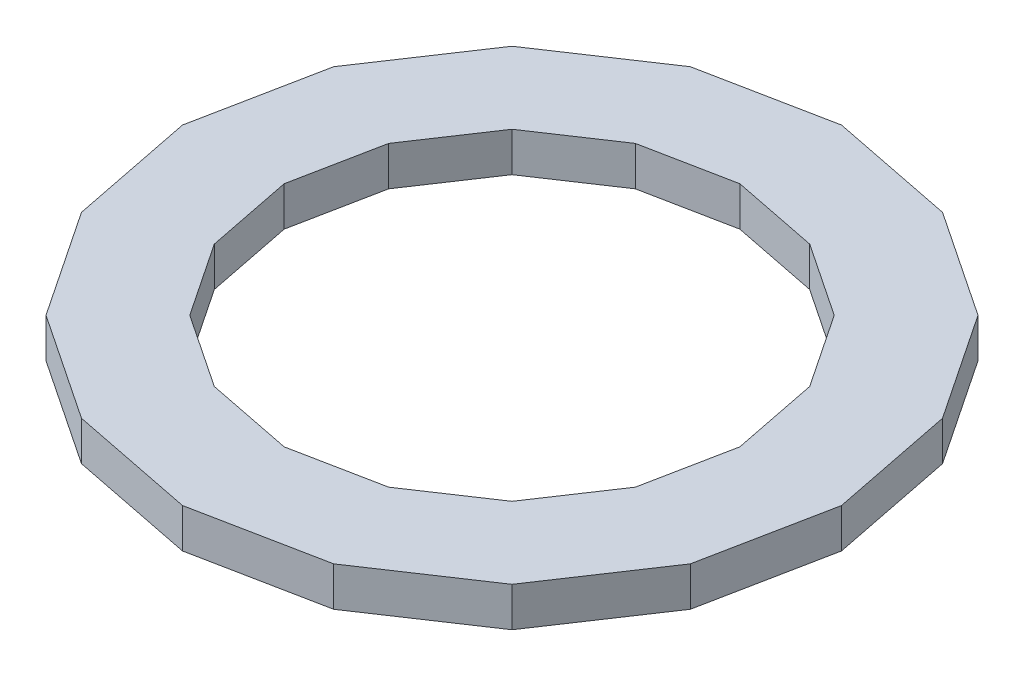
ISO-10303-21;
HEADER;
FILE_DESCRIPTION(('STEP AP214'),'2;1');
FILE_NAME('part.step','',(''),(''),'','','');
FILE_SCHEMA(('AUTOMOTIVE_DESIGN { 1 0 10303 214 1 1 1 1 }'));
ENDSEC;
DATA;
#1=APPLICATION_CONTEXT('core data for automotive mechanical design processes');
#2=APPLICATION_PROTOCOL_DEFINITION('international standard','automotive_design',2000,#1);
#3=PRODUCT_CONTEXT('',#1,'mechanical');
#4=PRODUCT('Part','Part','',(#3));
#5=PRODUCT_RELATED_PRODUCT_CATEGORY('part','',(#4));
#6=PRODUCT_DEFINITION_FORMATION('','',#4);
#7=PRODUCT_DEFINITION_CONTEXT('part definition',#1,'design');
#8=PRODUCT_DEFINITION('design','',#6,#7);
#9=PRODUCT_DEFINITION_SHAPE('','',#8);
#10=(LENGTH_UNIT() NAMED_UNIT(*) SI_UNIT(.MILLI.,.METRE.));
#11=(NAMED_UNIT(*) PLANE_ANGLE_UNIT() SI_UNIT($,.RADIAN.));
#12=(NAMED_UNIT(*) SI_UNIT($,.STERADIAN.) SOLID_ANGLE_UNIT());
#13=UNCERTAINTY_MEASURE_WITH_UNIT(LENGTH_MEASURE(1.E-05),#10,'distance_accuracy_value','');
#14=(GEOMETRIC_REPRESENTATION_CONTEXT(3) GLOBAL_UNCERTAINTY_ASSIGNED_CONTEXT((#13)) GLOBAL_UNIT_ASSIGNED_CONTEXT((#10,
#11,#12)) REPRESENTATION_CONTEXT('',''));
#15=CARTESIAN_POINT('',(0.,0.,0.));
#16=DIRECTION('',(0.,0.,1.));
#17=DIRECTION('',(1.,0.,0.));
#18=AXIS2_PLACEMENT_3D('',#15,#16,#17);
#19=CARTESIAN_POINT('',(0.,19.05,0.));
#20=DIRECTION('',(0.,1.,0.));
#21=DIRECTION('',(0.,0.,1.));
#22=AXIS2_PLACEMENT_3D('',#19,#20,#21);
#23=PLANE('',#22);
#24=DIRECTION('',(0.195090322016117,0.,-0.980785280403233));
#25=VECTOR('',#24,1.);
#26=CARTESIAN_POINT('',(147.349757573891,19.05,61.0342679994914));
#27=LINE('',#26,#25);
#28=CARTESIAN_POINT('',(147.349757573891,19.05,61.0342679994914));
#29=VERTEX_POINT('',#28);
#30=CARTESIAN_POINT('',(159.490228312954,19.05,-1.72778951291163E-12));
#31=VERTEX_POINT('',#30);
#32=EDGE_CURVE('E377',#29,#31,#27,.T.);
#33=ORIENTED_EDGE('',*,*,#32,.T.);
#34=DIRECTION('',(-0.195090322016139,0.,-0.980785280403228));
#35=VECTOR('',#34,1.);
#36=CARTESIAN_POINT('',(159.490228312954,19.05,-1.72778951291163E-12));
#37=LINE('',#36,#35);
#38=CARTESIAN_POINT('',(147.34975757389,19.05,-61.0342679994946));
#39=VERTEX_POINT('',#38);
#40=EDGE_CURVE('E381',#31,#39,#37,.T.);
#41=ORIENTED_EDGE('',*,*,#40,.T.);
#42=DIRECTION('',(-0.555570233019612,0.,-0.831469612302539));
#43=VECTOR('',#42,1.);
#44=CARTESIAN_POINT('',(147.34975757389,19.05,-61.0342679994946));
#45=LINE('',#44,#43);
#46=CARTESIAN_POINT('',(112.776621973079,19.05,-112.776621973082));
#47=VERTEX_POINT('',#46);
#48=EDGE_CURVE('E385',#39,#47,#45,.T.);
#49=ORIENTED_EDGE('',*,*,#48,.T.);
#50=DIRECTION('',(-0.831469612302551,0.,-0.555570233019593));
#51=VECTOR('',#50,1.);
#52=CARTESIAN_POINT('',(112.776621973079,19.05,-112.776621973082));
#53=LINE('',#52,#51);
#54=CARTESIAN_POINT('',(61.0342679994913,19.05,-147.349757573891));
#55=VERTEX_POINT('',#54);
#56=EDGE_CURVE('E388',#47,#55,#53,.T.);
#57=ORIENTED_EDGE('',*,*,#56,.T.);
#58=DIRECTION('',(-0.980785280403233,0.,-0.195090322016117));
#59=VECTOR('',#58,1.);
#60=CARTESIAN_POINT('',(61.0342679994913,19.05,-147.349757573891));
#61=LINE('',#60,#59);
#62=CARTESIAN_POINT('',(-1.75551672665465E-12,19.05,-159.490228312954));
#63=VERTEX_POINT('',#62);
#64=EDGE_CURVE('E390',#55,#63,#61,.T.);
#65=ORIENTED_EDGE('',*,*,#64,.T.);
#66=DIRECTION('',(-0.980785280403228,0.,0.195090322016139));
#67=VECTOR('',#66,1.);
#68=CARTESIAN_POINT('',(-1.75551672665465E-12,19.05,-159.490228312954));
#69=LINE('',#68,#67);
#70=CARTESIAN_POINT('',(-61.0342679994947,19.05,-147.34975757389));
#71=VERTEX_POINT('',#70);
#72=EDGE_CURVE('E392',#63,#71,#69,.T.);
#73=ORIENTED_EDGE('',*,*,#72,.T.);
#74=DIRECTION('',(-0.831469612302539,0.,0.555570233019612));
#75=VECTOR('',#74,1.);
#76=CARTESIAN_POINT('',(-61.0342679994947,19.05,-147.34975757389));
#77=LINE('',#76,#75);
#78=CARTESIAN_POINT('',(-112.776621973082,19.05,-112.776621973079));
#79=VERTEX_POINT('',#78);
#80=EDGE_CURVE('E394',#71,#79,#77,.T.);
#81=ORIENTED_EDGE('',*,*,#80,.T.);
#82=DIRECTION('',(-0.555570233019593,0.,0.831469612302551));
#83=VECTOR('',#82,1.);
#84=CARTESIAN_POINT('',(-112.776621973082,19.05,-112.776621973079));
#85=LINE('',#84,#83);
#86=CARTESIAN_POINT('',(-147.349757573891,19.05,-61.0342679994913));
#87=VERTEX_POINT('',#86);
#88=EDGE_CURVE('E396',#79,#87,#85,.T.);
#89=ORIENTED_EDGE('',*,*,#88,.T.);
#90=DIRECTION('',(-0.195090322016117,0.,0.980785280403233));
#91=VECTOR('',#90,1.);
#92=CARTESIAN_POINT('',(-147.349757573891,19.05,-61.0342679994913));
#93=LINE('',#92,#91);
#94=CARTESIAN_POINT('',(-159.490228312954,19.05,1.80363225978175E-12));
#95=VERTEX_POINT('',#94);
#96=EDGE_CURVE('E398',#87,#95,#93,.T.);
#97=ORIENTED_EDGE('',*,*,#96,.T.);
#98=DIRECTION('',(0.195090322016139,0.,0.980785280403228));
#99=VECTOR('',#98,1.);
#100=CARTESIAN_POINT('',(-159.490228312954,19.05,1.80363225978175E-12));
#101=LINE('',#100,#99);
#102=CARTESIAN_POINT('',(-147.34975757389,19.05,61.0342679994947));
#103=VERTEX_POINT('',#102);
#104=EDGE_CURVE('E400',#95,#103,#101,.T.);
#105=ORIENTED_EDGE('',*,*,#104,.T.);
#106=DIRECTION('',(0.555570233019611,0.,0.831469612302539));
#107=VECTOR('',#106,1.);
#108=CARTESIAN_POINT('',(-147.34975757389,19.05,61.0342679994947));
#109=LINE('',#108,#107);
#110=CARTESIAN_POINT('',(-112.776621973079,19.05,112.776621973082));
#111=VERTEX_POINT('',#110);
#112=EDGE_CURVE('E402',#103,#111,#109,.T.);
#113=ORIENTED_EDGE('',*,*,#112,.T.);
#114=DIRECTION('',(0.831469612302551,0.,0.555570233019593));
#115=VECTOR('',#114,1.);
#116=CARTESIAN_POINT('',(-112.776621973079,19.05,112.776621973082));
#117=LINE('',#116,#115);
#118=CARTESIAN_POINT('',(-61.0342679994914,19.05,147.349757573891));
#119=VERTEX_POINT('',#118);
#120=EDGE_CURVE('E404',#111,#119,#117,.T.);
#121=ORIENTED_EDGE('',*,*,#120,.T.);
#122=DIRECTION('',(0.980785280403233,0.,0.195090322016117));
#123=VECTOR('',#122,1.);
#124=CARTESIAN_POINT('',(-61.0342679994914,19.05,147.349757573891));
#125=LINE('',#124,#123);
#126=CARTESIAN_POINT('',(1.70609786640707E-12,19.05,159.490228312954));
#127=VERTEX_POINT('',#126);
#128=EDGE_CURVE('E406',#119,#127,#125,.T.);
#129=ORIENTED_EDGE('',*,*,#128,.T.);
#130=DIRECTION('',(0.980785280403228,0.,-0.195090322016139));
#131=VECTOR('',#130,1.);
#132=CARTESIAN_POINT('',(1.70609786640707E-12,19.05,159.490228312954));
#133=LINE('',#132,#131);
#134=CARTESIAN_POINT('',(61.0342679994947,19.05,147.34975757389));
#135=VERTEX_POINT('',#134);
#136=EDGE_CURVE('E408',#127,#135,#133,.T.);
#137=ORIENTED_EDGE('',*,*,#136,.T.);
#138=DIRECTION('',(0.831469612302539,0.,-0.555570233019611));
#139=VECTOR('',#138,1.);
#140=CARTESIAN_POINT('',(61.0342679994947,19.05,147.34975757389));
#141=LINE('',#140,#139);
#142=CARTESIAN_POINT('',(112.776621973082,19.05,112.776621973079));
#143=VERTEX_POINT('',#142);
#144=EDGE_CURVE('E410',#135,#143,#141,.T.);
#145=ORIENTED_EDGE('',*,*,#144,.T.);
#146=DIRECTION('',(0.555570233019593,0.,-0.831469612302551));
#147=VECTOR('',#146,1.);
#148=CARTESIAN_POINT('',(112.776621973082,19.05,112.776621973079));
#149=LINE('',#148,#147);
#150=EDGE_CURVE('E412',#143,#29,#149,.T.);
#151=ORIENTED_EDGE('',*,*,#150,.T.);
#152=EDGE_LOOP('',(#33,#41,#49,#57,#65,#73,#81,#89,#97,#105,#113,#121,#129,#137,#145,#151));
#153=FACE_BOUND('',#152,.T.);
#154=DIRECTION('',(-0.19509032201614,0.,-0.980785280403228));
#155=VECTOR('',#154,1.);
#156=CARTESIAN_POINT('',(110.28475901782,19.05,-1.28436945901502E-12));
#157=LINE('',#156,#155);
#158=CARTESIAN_POINT('',(110.28475901782,19.05,-1.28436945901502E-12));
#159=VERTEX_POINT('',#158);
#160=CARTESIAN_POINT('',(101.889831604503,19.05,-42.2041501184974));
#161=VERTEX_POINT('',#160);
#162=EDGE_CURVE('E252',#159,#161,#157,.T.);
#163=ORIENTED_EDGE('',*,*,#162,.F.);
#164=DIRECTION('',(0.195090322016117,0.,-0.980785280403233));
#165=VECTOR('',#164,1.);
#166=CARTESIAN_POINT('',(101.889831604504,19.05,42.2041501184951));
#167=LINE('',#166,#165);
#168=CARTESIAN_POINT('',(101.889831604504,19.05,42.2041501184951));
#169=VERTEX_POINT('',#168);
#170=EDGE_CURVE('E243',#169,#159,#167,.T.);
#171=ORIENTED_EDGE('',*,*,#170,.F.);
#172=DIRECTION('',(0.555570233019593,0.,-0.831469612302552));
#173=VECTOR('',#172,1.);
#174=CARTESIAN_POINT('',(77.983100963026,19.05,77.9831009630241));
#175=LINE('',#174,#173);
#176=CARTESIAN_POINT('',(77.983100963026,19.05,77.9831009630241));
#177=VERTEX_POINT('',#176);
#178=EDGE_CURVE('E302',#177,#169,#175,.T.);
#179=ORIENTED_EDGE('',*,*,#178,.F.);
#180=DIRECTION('',(0.831469612302539,0.,-0.555570233019612));
#181=VECTOR('',#180,1.);
#182=CARTESIAN_POINT('',(42.2041501184975,19.05,101.889831604503));
#183=LINE('',#182,#181);
#184=CARTESIAN_POINT('',(42.2041501184975,19.05,101.889831604503));
#185=VERTEX_POINT('',#184);
#186=EDGE_CURVE('E300',#185,#177,#183,.T.);
#187=ORIENTED_EDGE('',*,*,#186,.F.);
#188=DIRECTION('',(0.980785280403228,0.,-0.19509032201614));
#189=VECTOR('',#188,1.);
#190=CARTESIAN_POINT('',(1.30543120234615E-12,19.05,110.28475901782));
#191=LINE('',#190,#189);
#192=CARTESIAN_POINT('',(1.30543120234615E-12,19.05,110.28475901782));
#193=VERTEX_POINT('',#192);
#194=EDGE_CURVE('E298',#193,#185,#191,.T.);
#195=ORIENTED_EDGE('',*,*,#194,.F.);
#196=DIRECTION('',(0.980785280403233,0.,0.195090322016117));
#197=VECTOR('',#196,1.);
#198=CARTESIAN_POINT('',(-42.204150118495,19.05,101.889831604504));
#199=LINE('',#198,#197);
#200=CARTESIAN_POINT('',(-42.204150118495,19.05,101.889831604504));
#201=VERTEX_POINT('',#200);
#202=EDGE_CURVE('E296',#201,#193,#199,.T.);
#203=ORIENTED_EDGE('',*,*,#202,.F.);
#204=DIRECTION('',(0.831469612302552,0.,0.555570233019592));
#205=VECTOR('',#204,1.);
#206=CARTESIAN_POINT('',(-77.983100963024,19.05,77.983100963026));
#207=LINE('',#206,#205);
#208=CARTESIAN_POINT('',(-77.983100963024,19.05,77.983100963026));
#209=VERTEX_POINT('',#208);
#210=EDGE_CURVE('E294',#209,#201,#207,.T.);
#211=ORIENTED_EDGE('',*,*,#210,.F.);
#212=DIRECTION('',(0.555570233019612,0.,0.831469612302539));
#213=VECTOR('',#212,1.);
#214=CARTESIAN_POINT('',(-101.889831604503,19.05,42.2041501184975));
#215=LINE('',#214,#213);
#216=CARTESIAN_POINT('',(-101.889831604503,19.05,42.2041501184975));
#217=VERTEX_POINT('',#216);
#218=EDGE_CURVE('E291',#217,#209,#215,.T.);
#219=ORIENTED_EDGE('',*,*,#218,.F.);
#220=DIRECTION('',(0.19509032201614,0.,0.980785280403228));
#221=VECTOR('',#220,1.);
#222=CARTESIAN_POINT('',(-110.28475901782,19.05,1.31795296718562E-12));
#223=LINE('',#222,#221);
#224=CARTESIAN_POINT('',(-110.28475901782,19.05,1.31795296718562E-12));
#225=VERTEX_POINT('',#224);
#226=EDGE_CURVE('E289',#225,#217,#223,.T.);
#227=ORIENTED_EDGE('',*,*,#226,.F.);
#228=DIRECTION('',(-0.195090322016117,0.,0.980785280403233));
#229=VECTOR('',#228,1.);
#230=CARTESIAN_POINT('',(-101.889831604504,19.05,-42.204150118495));
#231=LINE('',#230,#229);
#232=CARTESIAN_POINT('',(-101.889831604504,19.05,-42.204150118495));
#233=VERTEX_POINT('',#232);
#234=EDGE_CURVE('E286',#233,#225,#231,.T.);
#235=ORIENTED_EDGE('',*,*,#234,.F.);
#236=DIRECTION('',(-0.555570233019592,0.,0.831469612302552));
#237=VECTOR('',#236,1.);
#238=CARTESIAN_POINT('',(-77.9831009630259,19.05,-77.983100963024));
#239=LINE('',#238,#237);
#240=CARTESIAN_POINT('',(-77.9831009630259,19.05,-77.983100963024));
#241=VERTEX_POINT('',#240);
#242=EDGE_CURVE('E284',#241,#233,#239,.T.);
#243=ORIENTED_EDGE('',*,*,#242,.F.);
#244=DIRECTION('',(-0.831469612302538,0.,0.555570233019613));
#245=VECTOR('',#244,1.);
#246=CARTESIAN_POINT('',(-42.2041501184975,19.05,-101.889831604503));
#247=LINE('',#246,#245);
#248=CARTESIAN_POINT('',(-42.2041501184975,19.05,-101.889831604503));
#249=VERTEX_POINT('',#248);
#250=EDGE_CURVE('E281',#249,#241,#247,.T.);
#251=ORIENTED_EDGE('',*,*,#250,.F.);
#252=DIRECTION('',(-0.980785280403228,0.,0.19509032201614));
#253=VECTOR('',#252,1.);
#254=CARTESIAN_POINT('',(-1.29763754362119E-12,19.05,-110.28475901782));
#255=LINE('',#254,#253);
#256=CARTESIAN_POINT('',(-1.29763754362119E-12,19.05,-110.28475901782));
#257=VERTEX_POINT('',#256);
#258=EDGE_CURVE('E279',#257,#249,#255,.T.);
#259=ORIENTED_EDGE('',*,*,#258,.F.);
#260=DIRECTION('',(-0.980785280403233,0.,-0.195090322016116));
#261=VECTOR('',#260,1.);
#262=CARTESIAN_POINT('',(42.2041501184951,19.05,-101.889831604504));
#263=LINE('',#262,#261);
#264=CARTESIAN_POINT('',(42.2041501184951,19.05,-101.889831604504));
#265=VERTEX_POINT('',#264);
#266=EDGE_CURVE('E277',#265,#257,#263,.T.);
#267=ORIENTED_EDGE('',*,*,#266,.F.);
#268=DIRECTION('',(-0.831469612302552,0.,-0.555570233019592));
#269=VECTOR('',#268,1.);
#270=CARTESIAN_POINT('',(77.9831009630241,19.05,-77.9831009630259));
#271=LINE('',#270,#269);
#272=CARTESIAN_POINT('',(77.9831009630241,19.05,-77.9831009630259));
#273=VERTEX_POINT('',#272);
#274=EDGE_CURVE('E272',#273,#265,#271,.T.);
#275=ORIENTED_EDGE('',*,*,#274,.F.);
#276=DIRECTION('',(-0.555570233019613,0.,-0.831469612302539));
#277=VECTOR('',#276,1.);
#278=CARTESIAN_POINT('',(101.889831604503,19.05,-42.2041501184974));
#279=LINE('',#278,#277);
#280=EDGE_CURVE('E265',#161,#273,#279,.T.);
#281=ORIENTED_EDGE('',*,*,#280,.F.);
#282=EDGE_LOOP('',(#163,#171,#179,#187,#195,#203,#211,#219,#227,#235,#243,#251,#259,#267,#275,#281));
#283=FACE_BOUND('',#282,.T.);
#284=ADVANCED_FACE('F34',(#153,#283),#23,.T.);
#285=CARTESIAN_POINT('',(0.,0.,0.));
#286=DIRECTION('',(0.,1.,0.));
#287=DIRECTION('',(0.,0.,1.));
#288=AXIS2_PLACEMENT_3D('',#285,#286,#287);
#289=PLANE('',#288);
#290=DIRECTION('',(0.195090322016117,0.,-0.980785280403233));
#291=VECTOR('',#290,1.);
#292=CARTESIAN_POINT('',(147.349757573891,0.,61.0342679994914));
#293=LINE('',#292,#291);
#294=CARTESIAN_POINT('',(147.349757573891,0.,61.0342679994914));
#295=VERTEX_POINT('',#294);
#296=CARTESIAN_POINT('',(159.490228312954,0.,-1.72778951291163E-12));
#297=VERTEX_POINT('',#296);
#298=EDGE_CURVE('E260',#295,#297,#293,.T.);
#299=ORIENTED_EDGE('',*,*,#298,.F.);
#300=DIRECTION('',(0.555570233019593,0.,-0.831469612302551));
#301=VECTOR('',#300,1.);
#302=CARTESIAN_POINT('',(112.776621973082,0.,112.776621973079));
#303=LINE('',#302,#301);
#304=CARTESIAN_POINT('',(112.776621973082,0.,112.776621973079));
#305=VERTEX_POINT('',#304);
#306=EDGE_CURVE('E382',#305,#295,#303,.T.);
#307=ORIENTED_EDGE('',*,*,#306,.F.);
#308=DIRECTION('',(0.831469612302539,0.,-0.555570233019611));
#309=VECTOR('',#308,1.);
#310=CARTESIAN_POINT('',(61.0342679994947,0.,147.34975757389));
#311=LINE('',#310,#309);
#312=CARTESIAN_POINT('',(61.0342679994947,0.,147.34975757389));
#313=VERTEX_POINT('',#312);
#314=EDGE_CURVE('E445',#313,#305,#311,.T.);
#315=ORIENTED_EDGE('',*,*,#314,.F.);
#316=DIRECTION('',(0.980785280403228,0.,-0.195090322016139));
#317=VECTOR('',#316,1.);
#318=CARTESIAN_POINT('',(1.70609786640707E-12,0.,159.490228312954));
#319=LINE('',#318,#317);
#320=CARTESIAN_POINT('',(1.70609786640707E-12,0.,159.490228312954));
#321=VERTEX_POINT('',#320);
#322=EDGE_CURVE('E443',#321,#313,#319,.T.);
#323=ORIENTED_EDGE('',*,*,#322,.F.);
#324=DIRECTION('',(0.980785280403233,0.,0.195090322016117));
#325=VECTOR('',#324,1.);
#326=CARTESIAN_POINT('',(-61.0342679994914,0.,147.349757573891));
#327=LINE('',#326,#325);
#328=CARTESIAN_POINT('',(-61.0342679994914,0.,147.349757573891));
#329=VERTEX_POINT('',#328);
#330=EDGE_CURVE('E441',#329,#321,#327,.T.);
#331=ORIENTED_EDGE('',*,*,#330,.F.);
#332=DIRECTION('',(0.831469612302551,0.,0.555570233019593));
#333=VECTOR('',#332,1.);
#334=CARTESIAN_POINT('',(-112.776621973079,0.,112.776621973082));
#335=LINE('',#334,#333);
#336=CARTESIAN_POINT('',(-112.776621973079,0.,112.776621973082));
#337=VERTEX_POINT('',#336);
#338=EDGE_CURVE('E439',#337,#329,#335,.T.);
#339=ORIENTED_EDGE('',*,*,#338,.F.);
#340=DIRECTION('',(0.555570233019611,0.,0.831469612302539));
#341=VECTOR('',#340,1.);
#342=CARTESIAN_POINT('',(-147.34975757389,0.,61.0342679994947));
#343=LINE('',#342,#341);
#344=CARTESIAN_POINT('',(-147.34975757389,0.,61.0342679994947));
#345=VERTEX_POINT('',#344);
#346=EDGE_CURVE('E437',#345,#337,#343,.T.);
#347=ORIENTED_EDGE('',*,*,#346,.F.);
#348=DIRECTION('',(0.195090322016139,0.,0.980785280403228));
#349=VECTOR('',#348,1.);
#350=CARTESIAN_POINT('',(-159.490228312954,0.,1.80363225978175E-12));
#351=LINE('',#350,#349);
#352=CARTESIAN_POINT('',(-159.490228312954,0.,1.80363225978175E-12));
#353=VERTEX_POINT('',#352);
#354=EDGE_CURVE('E435',#353,#345,#351,.T.);
#355=ORIENTED_EDGE('',*,*,#354,.F.);
#356=DIRECTION('',(-0.195090322016117,0.,0.980785280403233));
#357=VECTOR('',#356,1.);
#358=CARTESIAN_POINT('',(-147.349757573891,0.,-61.0342679994913));
#359=LINE('',#358,#357);
#360=CARTESIAN_POINT('',(-147.349757573891,0.,-61.0342679994913));
#361=VERTEX_POINT('',#360);
#362=EDGE_CURVE('E433',#361,#353,#359,.T.);
#363=ORIENTED_EDGE('',*,*,#362,.F.);
#364=DIRECTION('',(-0.555570233019593,0.,0.831469612302551));
#365=VECTOR('',#364,1.);
#366=CARTESIAN_POINT('',(-112.776621973082,0.,-112.776621973079));
#367=LINE('',#366,#365);
#368=CARTESIAN_POINT('',(-112.776621973082,0.,-112.776621973079));
#369=VERTEX_POINT('',#368);
#370=EDGE_CURVE('E431',#369,#361,#367,.T.);
#371=ORIENTED_EDGE('',*,*,#370,.F.);
#372=DIRECTION('',(-0.831469612302539,0.,0.555570233019612));
#373=VECTOR('',#372,1.);
#374=CARTESIAN_POINT('',(-61.0342679994947,0.,-147.34975757389));
#375=LINE('',#374,#373);
#376=CARTESIAN_POINT('',(-61.0342679994947,0.,-147.34975757389));
#377=VERTEX_POINT('',#376);
#378=EDGE_CURVE('E429',#377,#369,#375,.T.);
#379=ORIENTED_EDGE('',*,*,#378,.F.);
#380=DIRECTION('',(-0.980785280403228,0.,0.195090322016139));
#381=VECTOR('',#380,1.);
#382=CARTESIAN_POINT('',(-1.75551672665465E-12,0.,-159.490228312954));
#383=LINE('',#382,#381);
#384=CARTESIAN_POINT('',(-1.75551672665465E-12,0.,-159.490228312954));
#385=VERTEX_POINT('',#384);
#386=EDGE_CURVE('E427',#385,#377,#383,.T.);
#387=ORIENTED_EDGE('',*,*,#386,.F.);
#388=DIRECTION('',(-0.980785280403233,0.,-0.195090322016117));
#389=VECTOR('',#388,1.);
#390=CARTESIAN_POINT('',(61.0342679994913,0.,-147.349757573891));
#391=LINE('',#390,#389);
#392=CARTESIAN_POINT('',(61.0342679994913,0.,-147.349757573891));
#393=VERTEX_POINT('',#392);
#394=EDGE_CURVE('E425',#393,#385,#391,.T.);
#395=ORIENTED_EDGE('',*,*,#394,.F.);
#396=DIRECTION('',(-0.831469612302551,0.,-0.555570233019593));
#397=VECTOR('',#396,1.);
#398=CARTESIAN_POINT('',(112.776621973079,0.,-112.776621973082));
#399=LINE('',#398,#397);
#400=CARTESIAN_POINT('',(112.776621973079,0.,-112.776621973082));
#401=VERTEX_POINT('',#400);
#402=EDGE_CURVE('E423',#401,#393,#399,.T.);
#403=ORIENTED_EDGE('',*,*,#402,.F.);
#404=DIRECTION('',(-0.555570233019612,0.,-0.831469612302539));
#405=VECTOR('',#404,1.);
#406=CARTESIAN_POINT('',(147.34975757389,0.,-61.0342679994946));
#407=LINE('',#406,#405);
#408=CARTESIAN_POINT('',(147.34975757389,0.,-61.0342679994946));
#409=VERTEX_POINT('',#408);
#410=EDGE_CURVE('E420',#409,#401,#407,.T.);
#411=ORIENTED_EDGE('',*,*,#410,.F.);
#412=DIRECTION('',(-0.195090322016139,0.,-0.980785280403228));
#413=VECTOR('',#412,1.);
#414=CARTESIAN_POINT('',(159.490228312954,0.,-1.72778951291163E-12));
#415=LINE('',#414,#413);
#416=EDGE_CURVE('E417',#297,#409,#415,.T.);
#417=ORIENTED_EDGE('',*,*,#416,.F.);
#418=EDGE_LOOP('',(#299,#307,#315,#323,#331,#339,#347,#355,#363,#371,#379,#387,#395,#403,#411,#417));
#419=FACE_BOUND('',#418,.T.);
#420=DIRECTION('',(0.195090322016117,0.,-0.980785280403233));
#421=VECTOR('',#420,1.);
#422=CARTESIAN_POINT('',(101.889831604504,0.,42.2041501184951));
#423=LINE('',#422,#421);
#424=CARTESIAN_POINT('',(101.889831604504,0.,42.2041501184951));
#425=VERTEX_POINT('',#424);
#426=CARTESIAN_POINT('',(110.28475901782,0.,-1.28436945901502E-12));
#427=VERTEX_POINT('',#426);
#428=EDGE_CURVE('E57',#425,#427,#423,.T.);
#429=ORIENTED_EDGE('',*,*,#428,.T.);
#430=DIRECTION('',(-0.19509032201614,0.,-0.980785280403228));
#431=VECTOR('',#430,1.);
#432=CARTESIAN_POINT('',(110.28475901782,0.,-1.28436945901502E-12));
#433=LINE('',#432,#431);
#434=CARTESIAN_POINT('',(101.889831604503,0.,-42.2041501184974));
#435=VERTEX_POINT('',#434);
#436=EDGE_CURVE('E259',#427,#435,#433,.T.);
#437=ORIENTED_EDGE('',*,*,#436,.T.);
#438=DIRECTION('',(-0.555570233019613,0.,-0.831469612302539));
#439=VECTOR('',#438,1.);
#440=CARTESIAN_POINT('',(101.889831604503,0.,-42.2041501184974));
#441=LINE('',#440,#439);
#442=CARTESIAN_POINT('',(77.9831009630241,0.,-77.9831009630259));
#443=VERTEX_POINT('',#442);
#444=EDGE_CURVE('E308',#435,#443,#441,.T.);
#445=ORIENTED_EDGE('',*,*,#444,.T.);
#446=DIRECTION('',(-0.831469612302552,0.,-0.555570233019592));
#447=VECTOR('',#446,1.);
#448=CARTESIAN_POINT('',(77.9831009630241,0.,-77.9831009630259));
#449=LINE('',#448,#447);
#450=CARTESIAN_POINT('',(42.2041501184951,0.,-101.889831604504));
#451=VERTEX_POINT('',#450);
#452=EDGE_CURVE('E311',#443,#451,#449,.T.);
#453=ORIENTED_EDGE('',*,*,#452,.T.);
#454=DIRECTION('',(-0.980785280403233,0.,-0.195090322016116));
#455=VECTOR('',#454,1.);
#456=CARTESIAN_POINT('',(42.2041501184951,0.,-101.889831604504));
#457=LINE('',#456,#455);
#458=CARTESIAN_POINT('',(-1.29763754362119E-12,0.,-110.28475901782));
#459=VERTEX_POINT('',#458);
#460=EDGE_CURVE('E314',#451,#459,#457,.T.);
#461=ORIENTED_EDGE('',*,*,#460,.T.);
#462=DIRECTION('',(-0.980785280403228,0.,0.19509032201614));
#463=VECTOR('',#462,1.);
#464=CARTESIAN_POINT('',(-1.29763754362119E-12,0.,-110.28475901782));
#465=LINE('',#464,#463);
#466=CARTESIAN_POINT('',(-42.2041501184975,0.,-101.889831604503));
#467=VERTEX_POINT('',#466);
#468=EDGE_CURVE('E317',#459,#467,#465,.T.);
#469=ORIENTED_EDGE('',*,*,#468,.T.);
#470=DIRECTION('',(-0.831469612302538,0.,0.555570233019613));
#471=VECTOR('',#470,1.);
#472=CARTESIAN_POINT('',(-42.2041501184975,0.,-101.889831604503));
#473=LINE('',#472,#471);
#474=CARTESIAN_POINT('',(-77.9831009630259,0.,-77.983100963024));
#475=VERTEX_POINT('',#474);
#476=EDGE_CURVE('E320',#467,#475,#473,.T.);
#477=ORIENTED_EDGE('',*,*,#476,.T.);
#478=DIRECTION('',(-0.555570233019592,0.,0.831469612302552));
#479=VECTOR('',#478,1.);
#480=CARTESIAN_POINT('',(-77.9831009630259,0.,-77.983100963024));
#481=LINE('',#480,#479);
#482=CARTESIAN_POINT('',(-101.889831604504,0.,-42.204150118495));
#483=VERTEX_POINT('',#482);
#484=EDGE_CURVE('E324',#475,#483,#481,.T.);
#485=ORIENTED_EDGE('',*,*,#484,.T.);
#486=DIRECTION('',(-0.195090322016117,0.,0.980785280403233));
#487=VECTOR('',#486,1.);
#488=CARTESIAN_POINT('',(-101.889831604504,0.,-42.204150118495));
#489=LINE('',#488,#487);
#490=CARTESIAN_POINT('',(-110.28475901782,0.,1.31795296718562E-12));
#491=VERTEX_POINT('',#490);
#492=EDGE_CURVE('E327',#483,#491,#489,.T.);
#493=ORIENTED_EDGE('',*,*,#492,.T.);
#494=DIRECTION('',(0.19509032201614,0.,0.980785280403228));
#495=VECTOR('',#494,1.);
#496=CARTESIAN_POINT('',(-110.28475901782,0.,1.31795296718562E-12));
#497=LINE('',#496,#495);
#498=CARTESIAN_POINT('',(-101.889831604503,0.,42.2041501184975));
#499=VERTEX_POINT('',#498);
#500=EDGE_CURVE('E330',#491,#499,#497,.T.);
#501=ORIENTED_EDGE('',*,*,#500,.T.);
#502=DIRECTION('',(0.555570233019612,0.,0.831469612302539));
#503=VECTOR('',#502,1.);
#504=CARTESIAN_POINT('',(-101.889831604503,0.,42.2041501184975));
#505=LINE('',#504,#503);
#506=CARTESIAN_POINT('',(-77.983100963024,0.,77.983100963026));
#507=VERTEX_POINT('',#506);
#508=EDGE_CURVE('E333',#499,#507,#505,.T.);
#509=ORIENTED_EDGE('',*,*,#508,.T.);
#510=DIRECTION('',(0.831469612302552,0.,0.555570233019592));
#511=VECTOR('',#510,1.);
#512=CARTESIAN_POINT('',(-77.983100963024,0.,77.983100963026));
#513=LINE('',#512,#511);
#514=CARTESIAN_POINT('',(-42.204150118495,0.,101.889831604504));
#515=VERTEX_POINT('',#514);
#516=EDGE_CURVE('E336',#507,#515,#513,.T.);
#517=ORIENTED_EDGE('',*,*,#516,.T.);
#518=DIRECTION('',(0.980785280403233,0.,0.195090322016117));
#519=VECTOR('',#518,1.);
#520=CARTESIAN_POINT('',(-42.204150118495,0.,101.889831604504));
#521=LINE('',#520,#519);
#522=CARTESIAN_POINT('',(1.30543120234615E-12,0.,110.28475901782));
#523=VERTEX_POINT('',#522);
#524=EDGE_CURVE('E339',#515,#523,#521,.T.);
#525=ORIENTED_EDGE('',*,*,#524,.T.);
#526=DIRECTION('',(0.980785280403228,0.,-0.19509032201614));
#527=VECTOR('',#526,1.);
#528=CARTESIAN_POINT('',(1.30543120234615E-12,0.,110.28475901782));
#529=LINE('',#528,#527);
#530=CARTESIAN_POINT('',(42.2041501184975,0.,101.889831604503));
#531=VERTEX_POINT('',#530);
#532=EDGE_CURVE('E342',#523,#531,#529,.T.);
#533=ORIENTED_EDGE('',*,*,#532,.T.);
#534=DIRECTION('',(0.831469612302539,0.,-0.555570233019612));
#535=VECTOR('',#534,1.);
#536=CARTESIAN_POINT('',(42.2041501184975,0.,101.889831604503));
#537=LINE('',#536,#535);
#538=CARTESIAN_POINT('',(77.983100963026,0.,77.9831009630241));
#539=VERTEX_POINT('',#538);
#540=EDGE_CURVE('E345',#531,#539,#537,.T.);
#541=ORIENTED_EDGE('',*,*,#540,.T.);
#542=DIRECTION('',(0.555570233019593,0.,-0.831469612302552));
#543=VECTOR('',#542,1.);
#544=CARTESIAN_POINT('',(77.983100963026,0.,77.9831009630241));
#545=LINE('',#544,#543);
#546=EDGE_CURVE('E253',#539,#425,#545,.T.);
#547=ORIENTED_EDGE('',*,*,#546,.T.);
#548=EDGE_LOOP('',(#429,#437,#445,#453,#461,#469,#477,#485,#493,#501,#509,#517,#525,#533,#541,#547));
#549=FACE_BOUND('',#548,.T.);
#550=ADVANCED_FACE('F501',(#419,#549),#289,.F.);
#551=CARTESIAN_POINT('',(147.349757573891,19.05,61.0342679994914));
#552=DIRECTION('',(-0.980785280403233,0.,-0.195090322016117));
#553=DIRECTION('',(-0.195090322016117,0.,0.980785280403233));
#554=AXIS2_PLACEMENT_3D('',#551,#552,#553);
#555=PLANE('',#554);
#556=ORIENTED_EDGE('',*,*,#298,.T.);
#557=DIRECTION('',(0.,-1.,0.));
#558=VECTOR('',#557,1.);
#559=CARTESIAN_POINT('',(159.490228312954,19.05,-1.72778951291163E-12));
#560=LINE('',#559,#558);
#561=EDGE_CURVE('E11',#31,#297,#560,.T.);
#562=ORIENTED_EDGE('',*,*,#561,.F.);
#563=ORIENTED_EDGE('',*,*,#32,.F.);
#564=DIRECTION('',(0.,-1.,0.));
#565=VECTOR('',#564,1.);
#566=CARTESIAN_POINT('',(147.349757573891,19.05,61.0342679994914));
#567=LINE('',#566,#565);
#568=EDGE_CURVE('E414',#29,#295,#567,.T.);
#569=ORIENTED_EDGE('',*,*,#568,.T.);
#570=EDGE_LOOP('',(#556,#562,#563,#569));
#571=FACE_BOUND('',#570,.T.);
#572=ADVANCED_FACE('F36',(#571),#555,.F.);
#573=CARTESIAN_POINT('',(159.490228312954,19.05,-1.72778951291163E-12));
#574=DIRECTION('',(-0.980785280403228,0.,0.195090322016139));
#575=DIRECTION('',(0.195090322016139,0.,0.980785280403228));
#576=AXIS2_PLACEMENT_3D('',#573,#574,#575);
#577=PLANE('',#576);
#578=ORIENTED_EDGE('',*,*,#416,.T.);
#579=DIRECTION('',(0.,-1.,0.));
#580=VECTOR('',#579,1.);
#581=CARTESIAN_POINT('',(147.34975757389,19.05,-61.0342679994946));
#582=LINE('',#581,#580);
#583=EDGE_CURVE('E42',#39,#409,#582,.T.);
#584=ORIENTED_EDGE('',*,*,#583,.F.);
#585=ORIENTED_EDGE('',*,*,#40,.F.);
#586=ORIENTED_EDGE('',*,*,#561,.T.);
#587=EDGE_LOOP('',(#578,#584,#585,#586));
#588=FACE_BOUND('',#587,.T.);
#589=ADVANCED_FACE('F518',(#588),#577,.F.);
#590=CARTESIAN_POINT('',(147.34975757389,19.05,-61.0342679994946));
#591=DIRECTION('',(-0.831469612302539,0.,0.555570233019612));
#592=DIRECTION('',(0.555570233019612,0.,0.831469612302539));
#593=AXIS2_PLACEMENT_3D('',#590,#591,#592);
#594=PLANE('',#593);
#595=ORIENTED_EDGE('',*,*,#410,.T.);
#596=DIRECTION('',(0.,-1.,0.));
#597=VECTOR('',#596,1.);
#598=CARTESIAN_POINT('',(112.776621973079,19.05,-112.776621973082));
#599=LINE('',#598,#597);
#600=EDGE_CURVE('E487',#47,#401,#599,.T.);
#601=ORIENTED_EDGE('',*,*,#600,.F.);
#602=ORIENTED_EDGE('',*,*,#48,.F.);
#603=ORIENTED_EDGE('',*,*,#583,.T.);
#604=EDGE_LOOP('',(#595,#601,#602,#603));
#605=FACE_BOUND('',#604,.T.);
#606=ADVANCED_FACE('F495',(#605),#594,.F.);
#607=CARTESIAN_POINT('',(112.776621973079,19.05,-112.776621973082));
#608=DIRECTION('',(-0.555570233019593,0.,0.831469612302551));
#609=DIRECTION('',(0.831469612302551,0.,0.555570233019593));
#610=AXIS2_PLACEMENT_3D('',#607,#608,#609);
#611=PLANE('',#610);
#612=ORIENTED_EDGE('',*,*,#402,.T.);
#613=DIRECTION('',(0.,-1.,0.));
#614=VECTOR('',#613,1.);
#615=CARTESIAN_POINT('',(61.0342679994913,19.05,-147.349757573891));
#616=LINE('',#615,#614);
#617=EDGE_CURVE('E484',#55,#393,#616,.T.);
#618=ORIENTED_EDGE('',*,*,#617,.F.);
#619=ORIENTED_EDGE('',*,*,#56,.F.);
#620=ORIENTED_EDGE('',*,*,#600,.T.);
#621=EDGE_LOOP('',(#612,#618,#619,#620));
#622=FACE_BOUND('',#621,.T.);
#623=ADVANCED_FACE('F507',(#622),#611,.F.);
#624=CARTESIAN_POINT('',(61.0342679994913,19.05,-147.349757573891));
#625=DIRECTION('',(-0.195090322016117,0.,0.980785280403233));
#626=DIRECTION('',(0.980785280403233,0.,0.195090322016117));
#627=AXIS2_PLACEMENT_3D('',#624,#625,#626);
#628=PLANE('',#627);
#629=ORIENTED_EDGE('',*,*,#394,.T.);
#630=DIRECTION('',(0.,-1.,0.));
#631=VECTOR('',#630,1.);
#632=CARTESIAN_POINT('',(-1.75551672665465E-12,19.05,-159.490228312954));
#633=LINE('',#632,#631);
#634=EDGE_CURVE('E481',#63,#385,#633,.T.);
#635=ORIENTED_EDGE('',*,*,#634,.F.);
#636=ORIENTED_EDGE('',*,*,#64,.F.);
#637=ORIENTED_EDGE('',*,*,#617,.T.);
#638=EDGE_LOOP('',(#629,#635,#636,#637));
#639=FACE_BOUND('',#638,.T.);
#640=ADVANCED_FACE('F511',(#639),#628,.F.);
#641=CARTESIAN_POINT('',(-1.75551672665465E-12,19.05,-159.490228312954));
#642=DIRECTION('',(0.195090322016139,0.,0.980785280403228));
#643=DIRECTION('',(0.980785280403228,0.,-0.195090322016139));
#644=AXIS2_PLACEMENT_3D('',#641,#642,#643);
#645=PLANE('',#644);
#646=ORIENTED_EDGE('',*,*,#386,.T.);
#647=DIRECTION('',(0.,-1.,0.));
#648=VECTOR('',#647,1.);
#649=CARTESIAN_POINT('',(-61.0342679994947,19.05,-147.34975757389));
#650=LINE('',#649,#648);
#651=EDGE_CURVE('E478',#71,#377,#650,.T.);
#652=ORIENTED_EDGE('',*,*,#651,.F.);
#653=ORIENTED_EDGE('',*,*,#72,.F.);
#654=ORIENTED_EDGE('',*,*,#634,.T.);
#655=EDGE_LOOP('',(#646,#652,#653,#654));
#656=FACE_BOUND('',#655,.T.);
#657=ADVANCED_FACE('F571',(#656),#645,.F.);
#658=CARTESIAN_POINT('',(-61.0342679994947,19.05,-147.34975757389));
#659=DIRECTION('',(0.555570233019612,0.,0.831469612302539));
#660=DIRECTION('',(0.831469612302539,0.,-0.555570233019612));
#661=AXIS2_PLACEMENT_3D('',#658,#659,#660);
#662=PLANE('',#661);
#663=ORIENTED_EDGE('',*,*,#378,.T.);
#664=DIRECTION('',(0.,-1.,0.));
#665=VECTOR('',#664,1.);
#666=CARTESIAN_POINT('',(-112.776621973082,19.05,-112.776621973079));
#667=LINE('',#666,#665);
#668=EDGE_CURVE('E474',#79,#369,#667,.T.);
#669=ORIENTED_EDGE('',*,*,#668,.F.);
#670=ORIENTED_EDGE('',*,*,#80,.F.);
#671=ORIENTED_EDGE('',*,*,#651,.T.);
#672=EDGE_LOOP('',(#663,#669,#670,#671));
#673=FACE_BOUND('',#672,.T.);
#674=ADVANCED_FACE('F568',(#673),#662,.F.);
#675=CARTESIAN_POINT('',(-112.776621973082,19.05,-112.776621973079));
#676=DIRECTION('',(0.831469612302551,0.,0.555570233019593));
#677=DIRECTION('',(0.555570233019593,0.,-0.831469612302551));
#678=AXIS2_PLACEMENT_3D('',#675,#676,#677);
#679=PLANE('',#678);
#680=ORIENTED_EDGE('',*,*,#370,.T.);
#681=DIRECTION('',(0.,-1.,0.));
#682=VECTOR('',#681,1.);
#683=CARTESIAN_POINT('',(-147.349757573891,19.05,-61.0342679994913));
#684=LINE('',#683,#682);
#685=EDGE_CURVE('E471',#87,#361,#684,.T.);
#686=ORIENTED_EDGE('',*,*,#685,.F.);
#687=ORIENTED_EDGE('',*,*,#88,.F.);
#688=ORIENTED_EDGE('',*,*,#668,.T.);
#689=EDGE_LOOP('',(#680,#686,#687,#688));
#690=FACE_BOUND('',#689,.T.);
#691=ADVANCED_FACE('F564',(#690),#679,.F.);
#692=CARTESIAN_POINT('',(-147.349757573891,19.05,-61.0342679994913));
#693=DIRECTION('',(0.980785280403233,0.,0.195090322016117));
#694=DIRECTION('',(0.195090322016117,0.,-0.980785280403233));
#695=AXIS2_PLACEMENT_3D('',#692,#693,#694);
#696=PLANE('',#695);
#697=ORIENTED_EDGE('',*,*,#362,.T.);
#698=DIRECTION('',(0.,-1.,0.));
#699=VECTOR('',#698,1.);
#700=CARTESIAN_POINT('',(-159.490228312954,19.05,1.80363225978175E-12));
#701=LINE('',#700,#699);
#702=EDGE_CURVE('E468',#95,#353,#701,.T.);
#703=ORIENTED_EDGE('',*,*,#702,.F.);
#704=ORIENTED_EDGE('',*,*,#96,.F.);
#705=ORIENTED_EDGE('',*,*,#685,.T.);
#706=EDGE_LOOP('',(#697,#703,#704,#705));
#707=FACE_BOUND('',#706,.T.);
#708=ADVANCED_FACE('F560',(#707),#696,.F.);
#709=CARTESIAN_POINT('',(-159.490228312954,19.05,1.80363225978175E-12));
#710=DIRECTION('',(0.980785280403228,0.,-0.195090322016139));
#711=DIRECTION('',(-0.195090322016139,0.,-0.980785280403228));
#712=AXIS2_PLACEMENT_3D('',#709,#710,#711);
#713=PLANE('',#712);
#714=ORIENTED_EDGE('',*,*,#354,.T.);
#715=DIRECTION('',(0.,-1.,0.));
#716=VECTOR('',#715,1.);
#717=CARTESIAN_POINT('',(-147.34975757389,19.05,61.0342679994947));
#718=LINE('',#717,#716);
#719=EDGE_CURVE('E465',#103,#345,#718,.T.);
#720=ORIENTED_EDGE('',*,*,#719,.F.);
#721=ORIENTED_EDGE('',*,*,#104,.F.);
#722=ORIENTED_EDGE('',*,*,#702,.T.);
#723=EDGE_LOOP('',(#714,#720,#721,#722));
#724=FACE_BOUND('',#723,.T.);
#725=ADVANCED_FACE('F555',(#724),#713,.F.);
#726=CARTESIAN_POINT('',(-147.34975757389,19.05,61.0342679994947));
#727=DIRECTION('',(0.831469612302539,0.,-0.555570233019611));
#728=DIRECTION('',(-0.555570233019611,0.,-0.831469612302539));
#729=AXIS2_PLACEMENT_3D('',#726,#727,#728);
#730=PLANE('',#729);
#731=ORIENTED_EDGE('',*,*,#346,.T.);
#732=DIRECTION('',(0.,-1.,0.));
#733=VECTOR('',#732,1.);
#734=CARTESIAN_POINT('',(-112.776621973079,19.05,112.776621973082));
#735=LINE('',#734,#733);
#736=EDGE_CURVE('E462',#111,#337,#735,.T.);
#737=ORIENTED_EDGE('',*,*,#736,.F.);
#738=ORIENTED_EDGE('',*,*,#112,.F.);
#739=ORIENTED_EDGE('',*,*,#719,.T.);
#740=EDGE_LOOP('',(#731,#737,#738,#739));
#741=FACE_BOUND('',#740,.T.);
#742=ADVANCED_FACE('F549',(#741),#730,.F.);
#743=CARTESIAN_POINT('',(-112.776621973079,19.05,112.776621973082));
#744=DIRECTION('',(0.555570233019593,0.,-0.831469612302551));
#745=DIRECTION('',(-0.831469612302551,0.,-0.555570233019593));
#746=AXIS2_PLACEMENT_3D('',#743,#744,#745);
#747=PLANE('',#746);
#748=ORIENTED_EDGE('',*,*,#338,.T.);
#749=DIRECTION('',(0.,-1.,0.));
#750=VECTOR('',#749,1.);
#751=CARTESIAN_POINT('',(-61.0342679994914,19.05,147.349757573891));
#752=LINE('',#751,#750);
#753=EDGE_CURVE('E459',#119,#329,#752,.T.);
#754=ORIENTED_EDGE('',*,*,#753,.F.);
#755=ORIENTED_EDGE('',*,*,#120,.F.);
#756=ORIENTED_EDGE('',*,*,#736,.T.);
#757=EDGE_LOOP('',(#748,#754,#755,#756));
#758=FACE_BOUND('',#757,.T.);
#759=ADVANCED_FACE('F545',(#758),#747,.F.);
#760=CARTESIAN_POINT('',(-61.0342679994914,19.05,147.349757573891));
#761=DIRECTION('',(0.195090322016117,0.,-0.980785280403233));
#762=DIRECTION('',(-0.980785280403233,0.,-0.195090322016117));
#763=AXIS2_PLACEMENT_3D('',#760,#761,#762);
#764=PLANE('',#763);
#765=ORIENTED_EDGE('',*,*,#330,.T.);
#766=DIRECTION('',(0.,-1.,0.));
#767=VECTOR('',#766,1.);
#768=CARTESIAN_POINT('',(1.70609786640707E-12,19.05,159.490228312954));
#769=LINE('',#768,#767);
#770=EDGE_CURVE('E456',#127,#321,#769,.T.);
#771=ORIENTED_EDGE('',*,*,#770,.F.);
#772=ORIENTED_EDGE('',*,*,#128,.F.);
#773=ORIENTED_EDGE('',*,*,#753,.T.);
#774=EDGE_LOOP('',(#765,#771,#772,#773));
#775=FACE_BOUND('',#774,.T.);
#776=ADVANCED_FACE('F540',(#775),#764,.F.);
#777=CARTESIAN_POINT('',(1.70609786640707E-12,19.05,159.490228312954));
#778=DIRECTION('',(-0.195090322016139,0.,-0.980785280403228));
#779=DIRECTION('',(-0.980785280403228,0.,0.195090322016139));
#780=AXIS2_PLACEMENT_3D('',#777,#778,#779);
#781=PLANE('',#780);
#782=ORIENTED_EDGE('',*,*,#322,.T.);
#783=DIRECTION('',(0.,-1.,0.));
#784=VECTOR('',#783,1.);
#785=CARTESIAN_POINT('',(61.0342679994947,19.05,147.34975757389));
#786=LINE('',#785,#784);
#787=EDGE_CURVE('E453',#135,#313,#786,.T.);
#788=ORIENTED_EDGE('',*,*,#787,.F.);
#789=ORIENTED_EDGE('',*,*,#136,.F.);
#790=ORIENTED_EDGE('',*,*,#770,.T.);
#791=EDGE_LOOP('',(#782,#788,#789,#790));
#792=FACE_BOUND('',#791,.T.);
#793=ADVANCED_FACE('F534',(#792),#781,.F.);
#794=CARTESIAN_POINT('',(61.0342679994947,19.05,147.34975757389));
#795=DIRECTION('',(-0.555570233019612,0.,-0.831469612302539));
#796=DIRECTION('',(-0.831469612302539,0.,0.555570233019612));
#797=AXIS2_PLACEMENT_3D('',#794,#795,#796);
#798=PLANE('',#797);
#799=ORIENTED_EDGE('',*,*,#314,.T.);
#800=DIRECTION('',(0.,-1.,0.));
#801=VECTOR('',#800,1.);
#802=CARTESIAN_POINT('',(112.776621973082,19.05,112.776621973079));
#803=LINE('',#802,#801);
#804=EDGE_CURVE('E450',#143,#305,#803,.T.);
#805=ORIENTED_EDGE('',*,*,#804,.F.);
#806=ORIENTED_EDGE('',*,*,#144,.F.);
#807=ORIENTED_EDGE('',*,*,#787,.T.);
#808=EDGE_LOOP('',(#799,#805,#806,#807));
#809=FACE_BOUND('',#808,.T.);
#810=ADVANCED_FACE('F530',(#809),#798,.F.);
#811=CARTESIAN_POINT('',(112.776621973082,19.05,112.776621973079));
#812=DIRECTION('',(-0.831469612302551,0.,-0.555570233019593));
#813=DIRECTION('',(-0.555570233019593,0.,0.831469612302551));
#814=AXIS2_PLACEMENT_3D('',#811,#812,#813);
#815=PLANE('',#814);
#816=ORIENTED_EDGE('',*,*,#306,.T.);
#817=ORIENTED_EDGE('',*,*,#568,.F.);
#818=ORIENTED_EDGE('',*,*,#150,.F.);
#819=ORIENTED_EDGE('',*,*,#804,.T.);
#820=EDGE_LOOP('',(#816,#817,#818,#819));
#821=FACE_BOUND('',#820,.T.);
#822=ADVANCED_FACE('F525',(#821),#815,.F.);
#823=CARTESIAN_POINT('',(101.889831604504,19.05,42.2041501184951));
#824=DIRECTION('',(-0.980785280403233,0.,-0.195090322016117));
#825=DIRECTION('',(-0.195090322016117,0.,0.980785280403233));
#826=AXIS2_PLACEMENT_3D('',#823,#824,#825);
#827=PLANE('',#826);
#828=ORIENTED_EDGE('',*,*,#428,.F.);
#829=DIRECTION('',(0.,-1.,0.));
#830=VECTOR('',#829,1.);
#831=CARTESIAN_POINT('',(101.889831604504,19.05,42.2041501184951));
#832=LINE('',#831,#830);
#833=EDGE_CURVE('E247',#169,#425,#832,.T.);
#834=ORIENTED_EDGE('',*,*,#833,.F.);
#835=ORIENTED_EDGE('',*,*,#170,.T.);
#836=DIRECTION('',(0.,-1.,0.));
#837=VECTOR('',#836,1.);
#838=CARTESIAN_POINT('',(110.28475901782,19.05,-1.28436945901502E-12));
#839=LINE('',#838,#837);
#840=EDGE_CURVE('E246',#159,#427,#839,.T.);
#841=ORIENTED_EDGE('',*,*,#840,.T.);
#842=EDGE_LOOP('',(#828,#834,#835,#841));
#843=FACE_BOUND('',#842,.T.);
#844=ADVANCED_FACE('F245',(#843),#827,.T.);
#845=CARTESIAN_POINT('',(110.28475901782,19.05,-1.28436945901502E-12));
#846=DIRECTION('',(-0.980785280403228,0.,0.19509032201614));
#847=DIRECTION('',(0.19509032201614,0.,0.980785280403228));
#848=AXIS2_PLACEMENT_3D('',#845,#846,#847);
#849=PLANE('',#848);
#850=ORIENTED_EDGE('',*,*,#436,.F.);
#851=ORIENTED_EDGE('',*,*,#840,.F.);
#852=ORIENTED_EDGE('',*,*,#162,.T.);
#853=DIRECTION('',(0.,-1.,0.));
#854=VECTOR('',#853,1.);
#855=CARTESIAN_POINT('',(101.889831604503,19.05,-42.2041501184974));
#856=LINE('',#855,#854);
#857=EDGE_CURVE('E261',#161,#435,#856,.T.);
#858=ORIENTED_EDGE('',*,*,#857,.T.);
#859=EDGE_LOOP('',(#850,#851,#852,#858));
#860=FACE_BOUND('',#859,.T.);
#861=ADVANCED_FACE('F256',(#860),#849,.T.);
#862=CARTESIAN_POINT('',(101.889831604503,19.05,-42.2041501184974));
#863=DIRECTION('',(-0.831469612302538,0.,0.555570233019612));
#864=DIRECTION('',(0.555570233019612,0.,0.831469612302538));
#865=AXIS2_PLACEMENT_3D('',#862,#863,#864);
#866=PLANE('',#865);
#867=ORIENTED_EDGE('',*,*,#444,.F.);
#868=ORIENTED_EDGE('',*,*,#857,.F.);
#869=ORIENTED_EDGE('',*,*,#280,.T.);
#870=DIRECTION('',(0.,-1.,0.));
#871=VECTOR('',#870,1.);
#872=CARTESIAN_POINT('',(77.9831009630241,19.05,-77.9831009630259));
#873=LINE('',#872,#871);
#874=EDGE_CURVE('E374',#273,#443,#873,.T.);
#875=ORIENTED_EDGE('',*,*,#874,.T.);
#876=EDGE_LOOP('',(#867,#868,#869,#875));
#877=FACE_BOUND('',#876,.T.);
#878=ADVANCED_FACE('F653',(#877),#866,.T.);
#879=CARTESIAN_POINT('',(77.9831009630241,19.05,-77.9831009630259));
#880=DIRECTION('',(-0.555570233019592,0.,0.831469612302552));
#881=DIRECTION('',(0.831469612302552,0.,0.555570233019592));
#882=AXIS2_PLACEMENT_3D('',#879,#880,#881);
#883=PLANE('',#882);
#884=ORIENTED_EDGE('',*,*,#452,.F.);
#885=ORIENTED_EDGE('',*,*,#874,.F.);
#886=ORIENTED_EDGE('',*,*,#274,.T.);
#887=DIRECTION('',(0.,-1.,0.));
#888=VECTOR('',#887,1.);
#889=CARTESIAN_POINT('',(42.2041501184951,19.05,-101.889831604504));
#890=LINE('',#889,#888);
#891=EDGE_CURVE('E372',#265,#451,#890,.T.);
#892=ORIENTED_EDGE('',*,*,#891,.T.);
#893=EDGE_LOOP('',(#884,#885,#886,#892));
#894=FACE_BOUND('',#893,.T.);
#895=ADVANCED_FACE('F659',(#894),#883,.T.);
#896=CARTESIAN_POINT('',(42.2041501184951,19.05,-101.889831604504));
#897=DIRECTION('',(-0.195090322016116,0.,0.980785280403233));
#898=DIRECTION('',(0.980785280403233,0.,0.195090322016116));
#899=AXIS2_PLACEMENT_3D('',#896,#897,#898);
#900=PLANE('',#899);
#901=ORIENTED_EDGE('',*,*,#460,.F.);
#902=ORIENTED_EDGE('',*,*,#891,.F.);
#903=ORIENTED_EDGE('',*,*,#266,.T.);
#904=DIRECTION('',(0.,-1.,0.));
#905=VECTOR('',#904,1.);
#906=CARTESIAN_POINT('',(-1.29763754362119E-12,19.05,-110.28475901782));
#907=LINE('',#906,#905);
#908=EDGE_CURVE('E370',#257,#459,#907,.T.);
#909=ORIENTED_EDGE('',*,*,#908,.T.);
#910=EDGE_LOOP('',(#901,#902,#903,#909));
#911=FACE_BOUND('',#910,.T.);
#912=ADVANCED_FACE('F667',(#911),#900,.T.);
#913=CARTESIAN_POINT('',(-1.29763754362119E-12,19.05,-110.28475901782));
#914=DIRECTION('',(0.19509032201614,0.,0.980785280403228));
#915=DIRECTION('',(0.980785280403228,0.,-0.19509032201614));
#916=AXIS2_PLACEMENT_3D('',#913,#914,#915);
#917=PLANE('',#916);
#918=ORIENTED_EDGE('',*,*,#468,.F.);
#919=ORIENTED_EDGE('',*,*,#908,.F.);
#920=ORIENTED_EDGE('',*,*,#258,.T.);
#921=DIRECTION('',(0.,-1.,0.));
#922=VECTOR('',#921,1.);
#923=CARTESIAN_POINT('',(-42.2041501184975,19.05,-101.889831604503));
#924=LINE('',#923,#922);
#925=EDGE_CURVE('E368',#249,#467,#924,.T.);
#926=ORIENTED_EDGE('',*,*,#925,.T.);
#927=EDGE_LOOP('',(#918,#919,#920,#926));
#928=FACE_BOUND('',#927,.T.);
#929=ADVANCED_FACE('F675',(#928),#917,.T.);
#930=CARTESIAN_POINT('',(-42.2041501184975,19.05,-101.889831604503));
#931=DIRECTION('',(0.555570233019613,0.,0.831469612302538));
#932=DIRECTION('',(0.831469612302538,0.,-0.555570233019613));
#933=AXIS2_PLACEMENT_3D('',#930,#931,#932);
#934=PLANE('',#933);
#935=ORIENTED_EDGE('',*,*,#476,.F.);
#936=ORIENTED_EDGE('',*,*,#925,.F.);
#937=ORIENTED_EDGE('',*,*,#250,.T.);
#938=DIRECTION('',(0.,-1.,0.));
#939=VECTOR('',#938,1.);
#940=CARTESIAN_POINT('',(-77.9831009630259,19.05,-77.983100963024));
#941=LINE('',#940,#939);
#942=EDGE_CURVE('E366',#241,#475,#941,.T.);
#943=ORIENTED_EDGE('',*,*,#942,.T.);
#944=EDGE_LOOP('',(#935,#936,#937,#943));
#945=FACE_BOUND('',#944,.T.);
#946=ADVANCED_FACE('F683',(#945),#934,.T.);
#947=CARTESIAN_POINT('',(-77.9831009630259,19.05,-77.983100963024));
#948=DIRECTION('',(0.831469612302552,0.,0.555570233019592));
#949=DIRECTION('',(0.555570233019592,0.,-0.831469612302552));
#950=AXIS2_PLACEMENT_3D('',#947,#948,#949);
#951=PLANE('',#950);
#952=ORIENTED_EDGE('',*,*,#484,.F.);
#953=ORIENTED_EDGE('',*,*,#942,.F.);
#954=ORIENTED_EDGE('',*,*,#242,.T.);
#955=DIRECTION('',(0.,-1.,0.));
#956=VECTOR('',#955,1.);
#957=CARTESIAN_POINT('',(-101.889831604504,19.05,-42.204150118495));
#958=LINE('',#957,#956);
#959=EDGE_CURVE('E364',#233,#483,#958,.T.);
#960=ORIENTED_EDGE('',*,*,#959,.T.);
#961=EDGE_LOOP('',(#952,#953,#954,#960));
#962=FACE_BOUND('',#961,.T.);
#963=ADVANCED_FACE('F691',(#962),#951,.T.);
#964=CARTESIAN_POINT('',(-101.889831604504,19.05,-42.204150118495));
#965=DIRECTION('',(0.980785280403233,0.,0.195090322016117));
#966=DIRECTION('',(0.195090322016117,0.,-0.980785280403233));
#967=AXIS2_PLACEMENT_3D('',#964,#965,#966);
#968=PLANE('',#967);
#969=ORIENTED_EDGE('',*,*,#492,.F.);
#970=ORIENTED_EDGE('',*,*,#959,.F.);
#971=ORIENTED_EDGE('',*,*,#234,.T.);
#972=DIRECTION('',(0.,-1.,0.));
#973=VECTOR('',#972,1.);
#974=CARTESIAN_POINT('',(-110.28475901782,19.05,1.31795296718562E-12));
#975=LINE('',#974,#973);
#976=EDGE_CURVE('E362',#225,#491,#975,.T.);
#977=ORIENTED_EDGE('',*,*,#976,.T.);
#978=EDGE_LOOP('',(#969,#970,#971,#977));
#979=FACE_BOUND('',#978,.T.);
#980=ADVANCED_FACE('F699',(#979),#968,.T.);
#981=CARTESIAN_POINT('',(-110.28475901782,19.05,1.31795296718562E-12));
#982=DIRECTION('',(0.980785280403228,0.,-0.19509032201614));
#983=DIRECTION('',(-0.19509032201614,0.,-0.980785280403228));
#984=AXIS2_PLACEMENT_3D('',#981,#982,#983);
#985=PLANE('',#984);
#986=ORIENTED_EDGE('',*,*,#500,.F.);
#987=ORIENTED_EDGE('',*,*,#976,.F.);
#988=ORIENTED_EDGE('',*,*,#226,.T.);
#989=DIRECTION('',(0.,-1.,0.));
#990=VECTOR('',#989,1.);
#991=CARTESIAN_POINT('',(-101.889831604503,19.05,42.2041501184975));
#992=LINE('',#991,#990);
#993=EDGE_CURVE('E360',#217,#499,#992,.T.);
#994=ORIENTED_EDGE('',*,*,#993,.T.);
#995=EDGE_LOOP('',(#986,#987,#988,#994));
#996=FACE_BOUND('',#995,.T.);
#997=ADVANCED_FACE('F707',(#996),#985,.T.);
#998=CARTESIAN_POINT('',(-101.889831604503,19.05,42.2041501184975));
#999=DIRECTION('',(0.831469612302539,0.,-0.555570233019612));
#1000=DIRECTION('',(-0.555570233019612,0.,-0.831469612302539));
#1001=AXIS2_PLACEMENT_3D('',#998,#999,#1000);
#1002=PLANE('',#1001);
#1003=ORIENTED_EDGE('',*,*,#508,.F.);
#1004=ORIENTED_EDGE('',*,*,#993,.F.);
#1005=ORIENTED_EDGE('',*,*,#218,.T.);
#1006=DIRECTION('',(0.,-1.,0.));
#1007=VECTOR('',#1006,1.);
#1008=CARTESIAN_POINT('',(-77.983100963024,19.05,77.983100963026));
#1009=LINE('',#1008,#1007);
#1010=EDGE_CURVE('E358',#209,#507,#1009,.T.);
#1011=ORIENTED_EDGE('',*,*,#1010,.T.);
#1012=EDGE_LOOP('',(#1003,#1004,#1005,#1011));
#1013=FACE_BOUND('',#1012,.T.);
#1014=ADVANCED_FACE('F715',(#1013),#1002,.T.);
#1015=CARTESIAN_POINT('',(-77.983100963024,19.05,77.983100963026));
#1016=DIRECTION('',(0.555570233019592,0.,-0.831469612302552));
#1017=DIRECTION('',(-0.831469612302552,0.,-0.555570233019592));
#1018=AXIS2_PLACEMENT_3D('',#1015,#1016,#1017);
#1019=PLANE('',#1018);
#1020=ORIENTED_EDGE('',*,*,#516,.F.);
#1021=ORIENTED_EDGE('',*,*,#1010,.F.);
#1022=ORIENTED_EDGE('',*,*,#210,.T.);
#1023=DIRECTION('',(0.,-1.,0.));
#1024=VECTOR('',#1023,1.);
#1025=CARTESIAN_POINT('',(-42.204150118495,19.05,101.889831604504));
#1026=LINE('',#1025,#1024);
#1027=EDGE_CURVE('E356',#201,#515,#1026,.T.);
#1028=ORIENTED_EDGE('',*,*,#1027,.T.);
#1029=EDGE_LOOP('',(#1020,#1021,#1022,#1028));
#1030=FACE_BOUND('',#1029,.T.);
#1031=ADVANCED_FACE('F723',(#1030),#1019,.T.);
#1032=CARTESIAN_POINT('',(-42.204150118495,19.05,101.889831604504));
#1033=DIRECTION('',(0.195090322016117,0.,-0.980785280403233));
#1034=DIRECTION('',(-0.980785280403233,0.,-0.195090322016117));
#1035=AXIS2_PLACEMENT_3D('',#1032,#1033,#1034);
#1036=PLANE('',#1035);
#1037=ORIENTED_EDGE('',*,*,#524,.F.);
#1038=ORIENTED_EDGE('',*,*,#1027,.F.);
#1039=ORIENTED_EDGE('',*,*,#202,.T.);
#1040=DIRECTION('',(0.,-1.,0.));
#1041=VECTOR('',#1040,1.);
#1042=CARTESIAN_POINT('',(1.30543120234615E-12,19.05,110.28475901782));
#1043=LINE('',#1042,#1041);
#1044=EDGE_CURVE('E354',#193,#523,#1043,.T.);
#1045=ORIENTED_EDGE('',*,*,#1044,.T.);
#1046=EDGE_LOOP('',(#1037,#1038,#1039,#1045));
#1047=FACE_BOUND('',#1046,.T.);
#1048=ADVANCED_FACE('F731',(#1047),#1036,.T.);
#1049=CARTESIAN_POINT('',(1.30543120234615E-12,19.05,110.28475901782));
#1050=DIRECTION('',(-0.19509032201614,0.,-0.980785280403228));
#1051=DIRECTION('',(-0.980785280403228,0.,0.19509032201614));
#1052=AXIS2_PLACEMENT_3D('',#1049,#1050,#1051);
#1053=PLANE('',#1052);
#1054=ORIENTED_EDGE('',*,*,#532,.F.);
#1055=ORIENTED_EDGE('',*,*,#1044,.F.);
#1056=ORIENTED_EDGE('',*,*,#194,.T.);
#1057=DIRECTION('',(0.,-1.,0.));
#1058=VECTOR('',#1057,1.);
#1059=CARTESIAN_POINT('',(42.2041501184975,19.05,101.889831604503));
#1060=LINE('',#1059,#1058);
#1061=EDGE_CURVE('E352',#185,#531,#1060,.T.);
#1062=ORIENTED_EDGE('',*,*,#1061,.T.);
#1063=EDGE_LOOP('',(#1054,#1055,#1056,#1062));
#1064=FACE_BOUND('',#1063,.T.);
#1065=ADVANCED_FACE('F739',(#1064),#1053,.T.);
#1066=CARTESIAN_POINT('',(42.2041501184975,19.05,101.889831604503));
#1067=DIRECTION('',(-0.555570233019612,0.,-0.831469612302539));
#1068=DIRECTION('',(-0.831469612302539,0.,0.555570233019612));
#1069=AXIS2_PLACEMENT_3D('',#1066,#1067,#1068);
#1070=PLANE('',#1069);
#1071=ORIENTED_EDGE('',*,*,#540,.F.);
#1072=ORIENTED_EDGE('',*,*,#1061,.F.);
#1073=ORIENTED_EDGE('',*,*,#186,.T.);
#1074=DIRECTION('',(0.,-1.,0.));
#1075=VECTOR('',#1074,1.);
#1076=CARTESIAN_POINT('',(77.983100963026,19.05,77.9831009630241));
#1077=LINE('',#1076,#1075);
#1078=EDGE_CURVE('E49',#177,#539,#1077,.T.);
#1079=ORIENTED_EDGE('',*,*,#1078,.T.);
#1080=EDGE_LOOP('',(#1071,#1072,#1073,#1079));
#1081=FACE_BOUND('',#1080,.T.);
#1082=ADVANCED_FACE('F747',(#1081),#1070,.T.);
#1083=CARTESIAN_POINT('',(77.983100963026,19.05,77.9831009630241));
#1084=DIRECTION('',(-0.831469612302552,0.,-0.555570233019593));
#1085=DIRECTION('',(-0.555570233019593,0.,0.831469612302552));
#1086=AXIS2_PLACEMENT_3D('',#1083,#1084,#1085);
#1087=PLANE('',#1086);
#1088=ORIENTED_EDGE('',*,*,#546,.F.);
#1089=ORIENTED_EDGE('',*,*,#1078,.F.);
#1090=ORIENTED_EDGE('',*,*,#178,.T.);
#1091=ORIENTED_EDGE('',*,*,#833,.T.);
#1092=EDGE_LOOP('',(#1088,#1089,#1090,#1091));
#1093=FACE_BOUND('',#1092,.T.);
#1094=ADVANCED_FACE('F755',(#1093),#1087,.T.);
#1095=CLOSED_SHELL('',(#284,#550,#572,#589,#606,#623,#640,#657,#674,#691,#708,#725,#742,#759,
#776,#793,#810,#822,#844,#861,#878,#895,#912,#929,#946,#963,#980,#997,#1014,#1031,#1048,#1065,
#1082,#1094));
#1096=MANIFOLD_SOLID_BREP('B2',#1095);
#1097=ADVANCED_BREP_SHAPE_REPRESENTATION('',(#18,#1096),#14);
#1098=SHAPE_DEFINITION_REPRESENTATION(#9,#1097);
ENDSEC;
END-ISO-10303-21;
